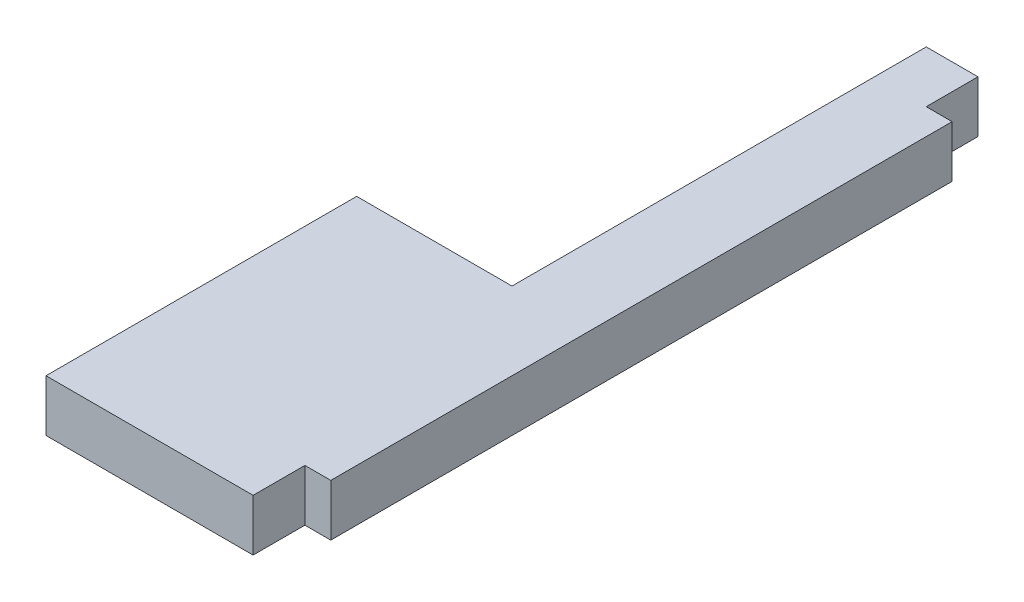
ISO-10303-21;
HEADER;
FILE_DESCRIPTION(('STEP AP214'),'2;1');
FILE_NAME('part.step','',(''),(''),'','','');
FILE_SCHEMA(('AUTOMOTIVE_DESIGN { 1 0 10303 214 1 1 1 1 }'));
ENDSEC;
DATA;
#1=APPLICATION_CONTEXT('core data for automotive mechanical design processes');
#2=APPLICATION_PROTOCOL_DEFINITION('international standard','automotive_design',2000,#1);
#3=PRODUCT_CONTEXT('',#1,'mechanical');
#4=PRODUCT('Part','Part','',(#3));
#5=PRODUCT_RELATED_PRODUCT_CATEGORY('part','',(#4));
#6=PRODUCT_DEFINITION_FORMATION('','',#4);
#7=PRODUCT_DEFINITION_CONTEXT('part definition',#1,'design');
#8=PRODUCT_DEFINITION('design','',#6,#7);
#9=PRODUCT_DEFINITION_SHAPE('','',#8);
#10=(LENGTH_UNIT() NAMED_UNIT(*) SI_UNIT(.MILLI.,.METRE.));
#11=(NAMED_UNIT(*) PLANE_ANGLE_UNIT() SI_UNIT($,.RADIAN.));
#12=(NAMED_UNIT(*) SI_UNIT($,.STERADIAN.) SOLID_ANGLE_UNIT());
#13=UNCERTAINTY_MEASURE_WITH_UNIT(LENGTH_MEASURE(1.E-05),#10,'distance_accuracy_value','');
#14=(GEOMETRIC_REPRESENTATION_CONTEXT(3) GLOBAL_UNCERTAINTY_ASSIGNED_CONTEXT((#13)) GLOBAL_UNIT_ASSIGNED_CONTEXT((#10,
#11,#12)) REPRESENTATION_CONTEXT('',''));
#15=CARTESIAN_POINT('',(0.,0.,0.));
#16=DIRECTION('',(0.,0.,1.));
#17=DIRECTION('',(1.,0.,0.));
#18=AXIS2_PLACEMENT_3D('',#15,#16,#17);
#19=CARTESIAN_POINT('',(0.,10.,-80.));
#20=DIRECTION('',(1.,0.,0.));
#21=DIRECTION('',(0.,0.,-1.));
#22=AXIS2_PLACEMENT_3D('',#19,#20,#21);
#23=PLANE('',#22);
#24=DIRECTION('',(0.,0.,1.));
#25=VECTOR('',#24,1.);
#26=CARTESIAN_POINT('',(0.,0.,-80.));
#27=LINE('',#26,#25);
#28=CARTESIAN_POINT('',(0.,0.,-80.));
#29=VERTEX_POINT('',#28);
#30=CARTESIAN_POINT('',(0.,0.,0.));
#31=VERTEX_POINT('',#30);
#32=EDGE_CURVE('E152',#29,#31,#27,.T.);
#33=ORIENTED_EDGE('',*,*,#32,.T.);
#34=DIRECTION('',(0.,-1.,0.));
#35=VECTOR('',#34,1.);
#36=CARTESIAN_POINT('',(0.,10.,0.));
#37=LINE('',#36,#35);
#38=CARTESIAN_POINT('',(0.,10.,0.));
#39=VERTEX_POINT('',#38);
#40=EDGE_CURVE('E11',#39,#31,#37,.T.);
#41=ORIENTED_EDGE('',*,*,#40,.F.);
#42=DIRECTION('',(0.,0.,1.));
#43=VECTOR('',#42,1.);
#44=CARTESIAN_POINT('',(0.,10.,-80.));
#45=LINE('',#44,#43);
#46=CARTESIAN_POINT('',(0.,10.,-80.));
#47=VERTEX_POINT('',#46);
#48=EDGE_CURVE('E180',#47,#39,#45,.T.);
#49=ORIENTED_EDGE('',*,*,#48,.F.);
#50=DIRECTION('',(0.,-1.,0.));
#51=VECTOR('',#50,1.);
#52=CARTESIAN_POINT('',(0.,10.,-80.));
#53=LINE('',#52,#51);
#54=EDGE_CURVE('E148',#47,#29,#53,.T.);
#55=ORIENTED_EDGE('',*,*,#54,.T.);
#56=EDGE_LOOP('',(#33,#41,#49,#55));
#57=FACE_BOUND('',#56,.T.);
#58=ADVANCED_FACE('F39',(#57),#23,.F.);
#59=CARTESIAN_POINT('',(0.,10.,0.));
#60=DIRECTION('',(0.,0.,1.));
#61=DIRECTION('',(1.,0.,0.));
#62=AXIS2_PLACEMENT_3D('',#59,#60,#61);
#63=PLANE('',#62);
#64=DIRECTION('',(-1.,0.,0.));
#65=VECTOR('',#64,1.);
#66=CARTESIAN_POINT('',(0.,0.,0.));
#67=LINE('',#66,#65);
#68=CARTESIAN_POINT('',(-30.,0.,0.));
#69=VERTEX_POINT('',#68);
#70=EDGE_CURVE('E156',#31,#69,#67,.T.);
#71=ORIENTED_EDGE('',*,*,#70,.T.);
#72=DIRECTION('',(0.,-1.,0.));
#73=VECTOR('',#72,1.);
#74=CARTESIAN_POINT('',(-30.,10.,0.));
#75=LINE('',#74,#73);
#76=CARTESIAN_POINT('',(-30.,10.,0.));
#77=VERTEX_POINT('',#76);
#78=EDGE_CURVE('E48',#77,#69,#75,.T.);
#79=ORIENTED_EDGE('',*,*,#78,.F.);
#80=DIRECTION('',(-1.,0.,0.));
#81=VECTOR('',#80,1.);
#82=CARTESIAN_POINT('',(0.,10.,0.));
#83=LINE('',#82,#81);
#84=EDGE_CURVE('E105',#39,#77,#83,.T.);
#85=ORIENTED_EDGE('',*,*,#84,.F.);
#86=ORIENTED_EDGE('',*,*,#40,.T.);
#87=EDGE_LOOP('',(#71,#79,#85,#86));
#88=FACE_BOUND('',#87,.T.);
#89=ADVANCED_FACE('F244',(#88),#63,.F.);
#90=CARTESIAN_POINT('',(-30.,10.,0.));
#91=DIRECTION('',(1.,0.,0.));
#92=DIRECTION('',(0.,0.,-1.));
#93=AXIS2_PLACEMENT_3D('',#90,#91,#92);
#94=PLANE('',#93);
#95=DIRECTION('',(0.,0.,1.));
#96=VECTOR('',#95,1.);
#97=CARTESIAN_POINT('',(-30.,0.,0.));
#98=LINE('',#97,#96);
#99=CARTESIAN_POINT('',(-30.,0.,60.));
#100=VERTEX_POINT('',#99);
#101=EDGE_CURVE('E159',#69,#100,#98,.T.);
#102=ORIENTED_EDGE('',*,*,#101,.T.);
#103=DIRECTION('',(0.,-1.,0.));
#104=VECTOR('',#103,1.);
#105=CARTESIAN_POINT('',(-30.,10.,60.));
#106=LINE('',#105,#104);
#107=CARTESIAN_POINT('',(-30.,10.,60.));
#108=VERTEX_POINT('',#107);
#109=EDGE_CURVE('E199',#108,#100,#106,.T.);
#110=ORIENTED_EDGE('',*,*,#109,.F.);
#111=DIRECTION('',(0.,0.,1.));
#112=VECTOR('',#111,1.);
#113=CARTESIAN_POINT('',(-30.,10.,0.));
#114=LINE('',#113,#112);
#115=EDGE_CURVE('E209',#77,#108,#114,.T.);
#116=ORIENTED_EDGE('',*,*,#115,.F.);
#117=ORIENTED_EDGE('',*,*,#78,.T.);
#118=EDGE_LOOP('',(#102,#110,#116,#117));
#119=FACE_BOUND('',#118,.T.);
#120=ADVANCED_FACE('F207',(#119),#94,.F.);
#121=CARTESIAN_POINT('',(-30.,10.,60.));
#122=DIRECTION('',(0.,0.,-1.));
#123=DIRECTION('',(-1.,0.,0.));
#124=AXIS2_PLACEMENT_3D('',#121,#122,#123);
#125=PLANE('',#124);
#126=DIRECTION('',(1.,0.,0.));
#127=VECTOR('',#126,1.);
#128=CARTESIAN_POINT('',(-30.,0.,60.));
#129=LINE('',#128,#127);
#130=CARTESIAN_POINT('',(9.99999999999999,0.,60.));
#131=VERTEX_POINT('',#130);
#132=EDGE_CURVE('E162',#100,#131,#129,.T.);
#133=ORIENTED_EDGE('',*,*,#132,.T.);
#134=DIRECTION('',(0.,-1.,0.));
#135=VECTOR('',#134,1.);
#136=CARTESIAN_POINT('',(9.99999999999999,10.,60.));
#137=LINE('',#136,#135);
#138=CARTESIAN_POINT('',(9.99999999999999,10.,60.));
#139=VERTEX_POINT('',#138);
#140=EDGE_CURVE('E195',#139,#131,#137,.T.);
#141=ORIENTED_EDGE('',*,*,#140,.F.);
#142=DIRECTION('',(1.,0.,0.));
#143=VECTOR('',#142,1.);
#144=CARTESIAN_POINT('',(-30.,10.,60.));
#145=LINE('',#144,#143);
#146=EDGE_CURVE('E228',#108,#139,#145,.T.);
#147=ORIENTED_EDGE('',*,*,#146,.F.);
#148=ORIENTED_EDGE('',*,*,#109,.T.);
#149=EDGE_LOOP('',(#133,#141,#147,#148));
#150=FACE_BOUND('',#149,.T.);
#151=ADVANCED_FACE('F218',(#150),#125,.F.);
#152=CARTESIAN_POINT('',(9.99999999999999,10.,60.));
#153=DIRECTION('',(-1.,0.,0.));
#154=DIRECTION('',(0.,0.,1.));
#155=AXIS2_PLACEMENT_3D('',#152,#153,#154);
#156=PLANE('',#155);
#157=DIRECTION('',(0.,0.,-1.));
#158=VECTOR('',#157,1.);
#159=CARTESIAN_POINT('',(9.99999999999999,0.,60.));
#160=LINE('',#159,#158);
#161=CARTESIAN_POINT('',(9.99999999999999,0.,50.));
#162=VERTEX_POINT('',#161);
#163=EDGE_CURVE('E165',#131,#162,#160,.T.);
#164=ORIENTED_EDGE('',*,*,#163,.T.);
#165=DIRECTION('',(0.,-1.,0.));
#166=VECTOR('',#165,1.);
#167=CARTESIAN_POINT('',(9.99999999999999,10.,50.));
#168=LINE('',#167,#166);
#169=CARTESIAN_POINT('',(9.99999999999999,10.,50.));
#170=VERTEX_POINT('',#169);
#171=EDGE_CURVE('E191',#170,#162,#168,.T.);
#172=ORIENTED_EDGE('',*,*,#171,.F.);
#173=DIRECTION('',(0.,0.,-1.));
#174=VECTOR('',#173,1.);
#175=CARTESIAN_POINT('',(9.99999999999999,10.,60.));
#176=LINE('',#175,#174);
#177=EDGE_CURVE('E224',#139,#170,#176,.T.);
#178=ORIENTED_EDGE('',*,*,#177,.F.);
#179=ORIENTED_EDGE('',*,*,#140,.T.);
#180=EDGE_LOOP('',(#164,#172,#178,#179));
#181=FACE_BOUND('',#180,.T.);
#182=ADVANCED_FACE('F222',(#181),#156,.F.);
#183=CARTESIAN_POINT('',(9.99999999999999,10.,50.));
#184=DIRECTION('',(0.,0.,-1.));
#185=DIRECTION('',(-1.,0.,0.));
#186=AXIS2_PLACEMENT_3D('',#183,#184,#185);
#187=PLANE('',#186);
#188=DIRECTION('',(1.,0.,0.));
#189=VECTOR('',#188,1.);
#190=CARTESIAN_POINT('',(9.99999999999999,0.,50.));
#191=LINE('',#190,#189);
#192=CARTESIAN_POINT('',(15.,0.,50.));
#193=VERTEX_POINT('',#192);
#194=EDGE_CURVE('E168',#162,#193,#191,.T.);
#195=ORIENTED_EDGE('',*,*,#194,.T.);
#196=DIRECTION('',(0.,-1.,0.));
#197=VECTOR('',#196,1.);
#198=CARTESIAN_POINT('',(15.,10.,50.));
#199=LINE('',#198,#197);
#200=CARTESIAN_POINT('',(15.,10.,50.));
#201=VERTEX_POINT('',#200);
#202=EDGE_CURVE('E187',#201,#193,#199,.T.);
#203=ORIENTED_EDGE('',*,*,#202,.F.);
#204=DIRECTION('',(1.,0.,0.));
#205=VECTOR('',#204,1.);
#206=CARTESIAN_POINT('',(9.99999999999999,10.,50.));
#207=LINE('',#206,#205);
#208=EDGE_CURVE('E227',#170,#201,#207,.T.);
#209=ORIENTED_EDGE('',*,*,#208,.F.);
#210=ORIENTED_EDGE('',*,*,#171,.T.);
#211=EDGE_LOOP('',(#195,#203,#209,#210));
#212=FACE_BOUND('',#211,.T.);
#213=ADVANCED_FACE('F256',(#212),#187,.F.);
#214=CARTESIAN_POINT('',(15.,10.,50.));
#215=DIRECTION('',(-1.,0.,0.));
#216=DIRECTION('',(0.,0.,1.));
#217=AXIS2_PLACEMENT_3D('',#214,#215,#216);
#218=PLANE('',#217);
#219=DIRECTION('',(0.,0.,-1.));
#220=VECTOR('',#219,1.);
#221=CARTESIAN_POINT('',(15.,0.,50.));
#222=LINE('',#221,#220);
#223=CARTESIAN_POINT('',(15.,0.,-70.));
#224=VERTEX_POINT('',#223);
#225=EDGE_CURVE('E171',#193,#224,#222,.T.);
#226=ORIENTED_EDGE('',*,*,#225,.T.);
#227=DIRECTION('',(0.,-1.,0.));
#228=VECTOR('',#227,1.);
#229=CARTESIAN_POINT('',(15.,10.,-70.));
#230=LINE('',#229,#228);
#231=CARTESIAN_POINT('',(15.,10.,-70.));
#232=VERTEX_POINT('',#231);
#233=EDGE_CURVE('E141',#232,#224,#230,.T.);
#234=ORIENTED_EDGE('',*,*,#233,.F.);
#235=DIRECTION('',(0.,0.,-1.));
#236=VECTOR('',#235,1.);
#237=CARTESIAN_POINT('',(15.,10.,50.));
#238=LINE('',#237,#236);
#239=EDGE_CURVE('E130',#201,#232,#238,.T.);
#240=ORIENTED_EDGE('',*,*,#239,.F.);
#241=ORIENTED_EDGE('',*,*,#202,.T.);
#242=EDGE_LOOP('',(#226,#234,#240,#241));
#243=FACE_BOUND('',#242,.T.);
#244=ADVANCED_FACE('F259',(#243),#218,.F.);
#245=CARTESIAN_POINT('',(15.,10.,-70.));
#246=DIRECTION('',(0.,0.,1.));
#247=DIRECTION('',(1.,0.,0.));
#248=AXIS2_PLACEMENT_3D('',#245,#246,#247);
#249=PLANE('',#248);
#250=DIRECTION('',(-1.,0.,0.));
#251=VECTOR('',#250,1.);
#252=CARTESIAN_POINT('',(15.,0.,-70.));
#253=LINE('',#252,#251);
#254=CARTESIAN_POINT('',(9.99999999999999,0.,-70.));
#255=VERTEX_POINT('',#254);
#256=EDGE_CURVE('E139',#224,#255,#253,.T.);
#257=ORIENTED_EDGE('',*,*,#256,.T.);
#258=DIRECTION('',(0.,-1.,0.));
#259=VECTOR('',#258,1.);
#260=CARTESIAN_POINT('',(9.99999999999999,10.,-70.));
#261=LINE('',#260,#259);
#262=CARTESIAN_POINT('',(9.99999999999999,10.,-70.));
#263=VERTEX_POINT('',#262);
#264=EDGE_CURVE('E136',#263,#255,#261,.T.);
#265=ORIENTED_EDGE('',*,*,#264,.F.);
#266=DIRECTION('',(-1.,0.,0.));
#267=VECTOR('',#266,1.);
#268=CARTESIAN_POINT('',(15.,10.,-70.));
#269=LINE('',#268,#267);
#270=EDGE_CURVE('E124',#232,#263,#269,.T.);
#271=ORIENTED_EDGE('',*,*,#270,.F.);
#272=ORIENTED_EDGE('',*,*,#233,.T.);
#273=EDGE_LOOP('',(#257,#265,#271,#272));
#274=FACE_BOUND('',#273,.T.);
#275=ADVANCED_FACE('F137',(#274),#249,.F.);
#276=CARTESIAN_POINT('',(9.99999999999999,10.,-70.));
#277=DIRECTION('',(-1.,0.,0.));
#278=DIRECTION('',(0.,0.,1.));
#279=AXIS2_PLACEMENT_3D('',#276,#277,#278);
#280=PLANE('',#279);
#281=DIRECTION('',(0.,0.,-1.));
#282=VECTOR('',#281,1.);
#283=CARTESIAN_POINT('',(9.99999999999999,0.,-70.));
#284=LINE('',#283,#282);
#285=CARTESIAN_POINT('',(10.,0.,-80.));
#286=VERTEX_POINT('',#285);
#287=EDGE_CURVE('E91',#255,#286,#284,.T.);
#288=ORIENTED_EDGE('',*,*,#287,.T.);
#289=DIRECTION('',(0.,-1.,0.));
#290=VECTOR('',#289,1.);
#291=CARTESIAN_POINT('',(10.,10.,-80.));
#292=LINE('',#291,#290);
#293=CARTESIAN_POINT('',(10.,10.,-80.));
#294=VERTEX_POINT('',#293);
#295=EDGE_CURVE('E142',#294,#286,#292,.T.);
#296=ORIENTED_EDGE('',*,*,#295,.F.);
#297=DIRECTION('',(0.,0.,-1.));
#298=VECTOR('',#297,1.);
#299=CARTESIAN_POINT('',(9.99999999999999,10.,-70.));
#300=LINE('',#299,#298);
#301=EDGE_CURVE('E128',#263,#294,#300,.T.);
#302=ORIENTED_EDGE('',*,*,#301,.F.);
#303=ORIENTED_EDGE('',*,*,#264,.T.);
#304=EDGE_LOOP('',(#288,#296,#302,#303));
#305=FACE_BOUND('',#304,.T.);
#306=ADVANCED_FACE('F144',(#305),#280,.F.);
#307=CARTESIAN_POINT('',(10.,10.,-80.));
#308=DIRECTION('',(0.,0.,1.));
#309=DIRECTION('',(1.,0.,0.));
#310=AXIS2_PLACEMENT_3D('',#307,#308,#309);
#311=PLANE('',#310);
#312=DIRECTION('',(-1.,0.,0.));
#313=VECTOR('',#312,1.);
#314=CARTESIAN_POINT('',(10.,0.,-80.));
#315=LINE('',#314,#313);
#316=EDGE_CURVE('E97',#286,#29,#315,.T.);
#317=ORIENTED_EDGE('',*,*,#316,.T.);
#318=ORIENTED_EDGE('',*,*,#54,.F.);
#319=DIRECTION('',(-1.,0.,0.));
#320=VECTOR('',#319,1.);
#321=CARTESIAN_POINT('',(10.,10.,-80.));
#322=LINE('',#321,#320);
#323=EDGE_CURVE('E56',#294,#47,#322,.T.);
#324=ORIENTED_EDGE('',*,*,#323,.F.);
#325=ORIENTED_EDGE('',*,*,#295,.T.);
#326=EDGE_LOOP('',(#317,#318,#324,#325));
#327=FACE_BOUND('',#326,.T.);
#328=ADVANCED_FACE('F268',(#327),#311,.F.);
#329=CARTESIAN_POINT('',(0.,10.,0.));
#330=DIRECTION('',(0.,-1.,0.));
#331=DIRECTION('',(0.,0.,-1.));
#332=AXIS2_PLACEMENT_3D('',#329,#330,#331);
#333=PLANE('',#332);
#334=ORIENTED_EDGE('',*,*,#48,.T.);
#335=ORIENTED_EDGE('',*,*,#84,.T.);
#336=ORIENTED_EDGE('',*,*,#115,.T.);
#337=ORIENTED_EDGE('',*,*,#146,.T.);
#338=ORIENTED_EDGE('',*,*,#177,.T.);
#339=ORIENTED_EDGE('',*,*,#208,.T.);
#340=ORIENTED_EDGE('',*,*,#239,.T.);
#341=ORIENTED_EDGE('',*,*,#270,.T.);
#342=ORIENTED_EDGE('',*,*,#301,.T.);
#343=ORIENTED_EDGE('',*,*,#323,.T.);
#344=EDGE_LOOP('',(#334,#335,#336,#337,#338,#339,#340,#341,#342,#343));
#345=FACE_BOUND('',#344,.T.);
#346=ADVANCED_FACE('F126',(#345),#333,.F.);
#347=CARTESIAN_POINT('',(0.,0.,0.));
#348=DIRECTION('',(0.,-1.,0.));
#349=DIRECTION('',(0.,0.,-1.));
#350=AXIS2_PLACEMENT_3D('',#347,#348,#349);
#351=PLANE('',#350);
#352=ORIENTED_EDGE('',*,*,#32,.F.);
#353=ORIENTED_EDGE('',*,*,#316,.F.);
#354=ORIENTED_EDGE('',*,*,#287,.F.);
#355=ORIENTED_EDGE('',*,*,#256,.F.);
#356=ORIENTED_EDGE('',*,*,#225,.F.);
#357=ORIENTED_EDGE('',*,*,#194,.F.);
#358=ORIENTED_EDGE('',*,*,#163,.F.);
#359=ORIENTED_EDGE('',*,*,#132,.F.);
#360=ORIENTED_EDGE('',*,*,#101,.F.);
#361=ORIENTED_EDGE('',*,*,#70,.F.);
#362=EDGE_LOOP('',(#352,#353,#354,#355,#356,#357,#358,#359,#360,#361));
#363=FACE_BOUND('',#362,.T.);
#364=ADVANCED_FACE('F213',(#363),#351,.T.);
#365=CLOSED_SHELL('',(#58,#89,#120,#151,#182,#213,#244,#275,#306,#328,#346,#364));
#366=MANIFOLD_SOLID_BREP('B2',#365);
#367=ADVANCED_BREP_SHAPE_REPRESENTATION('',(#18,#366),#14);
#368=SHAPE_DEFINITION_REPRESENTATION(#9,#367);
ENDSEC;
END-ISO-10303-21;
